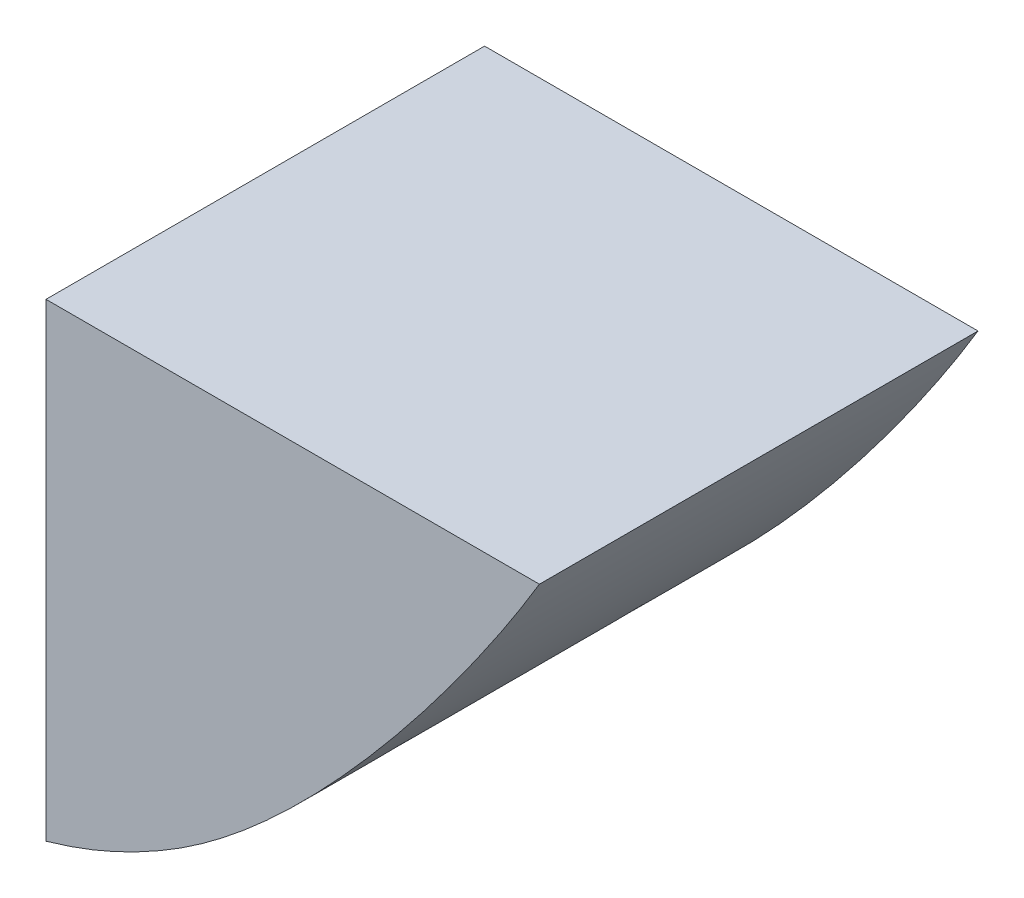
ISO-10303-21;
HEADER;
FILE_DESCRIPTION(('STEP AP214'),'2;1');
FILE_NAME('part.step','',(''),(''),'','','');
FILE_SCHEMA(('AUTOMOTIVE_DESIGN { 1 0 10303 214 1 1 1 1 }'));
ENDSEC;
DATA;
#1=APPLICATION_CONTEXT('core data for automotive mechanical design processes');
#2=APPLICATION_PROTOCOL_DEFINITION('international standard','automotive_design',2000,#1);
#3=PRODUCT_CONTEXT('',#1,'mechanical');
#4=PRODUCT('Part','Part','',(#3));
#5=PRODUCT_RELATED_PRODUCT_CATEGORY('part','',(#4));
#6=PRODUCT_DEFINITION_FORMATION('','',#4);
#7=PRODUCT_DEFINITION_CONTEXT('part definition',#1,'design');
#8=PRODUCT_DEFINITION('design','',#6,#7);
#9=PRODUCT_DEFINITION_SHAPE('','',#8);
#10=(LENGTH_UNIT() NAMED_UNIT(*) SI_UNIT(.MILLI.,.METRE.));
#11=(NAMED_UNIT(*) PLANE_ANGLE_UNIT() SI_UNIT($,.RADIAN.));
#12=(NAMED_UNIT(*) SI_UNIT($,.STERADIAN.) SOLID_ANGLE_UNIT());
#13=UNCERTAINTY_MEASURE_WITH_UNIT(LENGTH_MEASURE(1.E-05),#10,'distance_accuracy_value','');
#14=(GEOMETRIC_REPRESENTATION_CONTEXT(3) GLOBAL_UNCERTAINTY_ASSIGNED_CONTEXT((#13)) GLOBAL_UNIT_ASSIGNED_CONTEXT((#10,
#11,#12)) REPRESENTATION_CONTEXT('',''));
#15=CARTESIAN_POINT('',(0.,0.,0.));
#16=DIRECTION('',(0.,0.,1.));
#17=DIRECTION('',(1.,0.,0.));
#18=AXIS2_PLACEMENT_3D('',#15,#16,#17);
#19=CARTESIAN_POINT('',(0.,0.,8.));
#20=CARTESIAN_POINT('',(2.,0.,8.));
#21=CARTESIAN_POINT('',(5.,1.,8.));
#22=CARTESIAN_POINT('',(9.,4.,8.));
#23=CARTESIAN_POINT('',(12.,9.,8.));
#24=(BOUNDED_CURVE() B_SPLINE_CURVE(3,(#19,#20,#21,#22,#23),.UNSPECIFIED.,.F.,
.F.) B_SPLINE_CURVE_WITH_KNOTS((4,1,4),(0.,0.4,1.),
.UNSPECIFIED.) CURVE() GEOMETRIC_REPRESENTATION_ITEM() RATIONAL_B_SPLINE_CURVE((1.,0.8,1.3,0.9,1.1)) REPRESENTATION_ITEM(''));
#25=DIRECTION('',(0.,0.,-1.));
#26=VECTOR('',#25,1.);
#27=SURFACE_OF_LINEAR_EXTRUSION('',#24,#26);
#28=DIRECTION('',(0.,0.,-1.));
#29=VECTOR('',#28,1.);
#30=CARTESIAN_POINT('',(3.,0.439737105114699,8.));
#31=LINE('',#30,#29);
#32=CARTESIAN_POINT('',(3.,0.439737105114698,0.));
#33=VERTEX_POINT('',#32);
#34=CARTESIAN_POINT('',(3.,0.439737105114698,8.));
#35=VERTEX_POINT('',#34);
#36=EDGE_CURVE('E76',#33,#35,#31,.F.);
#37=ORIENTED_EDGE('',*,*,#36,.F.);
#38=CARTESIAN_POINT('',(0.,0.,0.));
#39=CARTESIAN_POINT('',(2.,0.,0.));
#40=CARTESIAN_POINT('',(5.,1.,0.));
#41=CARTESIAN_POINT('',(9.,4.,0.));
#42=CARTESIAN_POINT('',(12.,9.,0.));
#43=(BOUNDED_CURVE() B_SPLINE_CURVE(3,(#38,#39,#40,#41,#42),.UNSPECIFIED.,.F.,
.F.) B_SPLINE_CURVE_WITH_KNOTS((4,1,4),(0.,0.4,1.),
.UNSPECIFIED.) CURVE() GEOMETRIC_REPRESENTATION_ITEM() RATIONAL_B_SPLINE_CURVE((1.,0.8,1.3,0.9,1.1)) REPRESENTATION_ITEM(''));
#44=CARTESIAN_POINT('',(12.,9.,0.));
#45=VERTEX_POINT('',#44);
#46=EDGE_CURVE('E83',#33,#45,#43,.T.);
#47=ORIENTED_EDGE('',*,*,#46,.T.);
#48=DIRECTION('',(0.,0.,-1.));
#49=VECTOR('',#48,1.);
#50=CARTESIAN_POINT('',(12.,9.,8.));
#51=LINE('',#50,#49);
#52=CARTESIAN_POINT('',(12.,9.,8.));
#53=VERTEX_POINT('',#52);
#54=EDGE_CURVE('E49',#53,#45,#51,.T.);
#55=ORIENTED_EDGE('',*,*,#54,.F.);
#56=EDGE_CURVE('E64',#35,#53,#24,.T.);
#57=ORIENTED_EDGE('',*,*,#56,.F.);
#58=EDGE_LOOP('',(#37,#47,#55,#57));
#59=FACE_BOUND('',#58,.T.);
#60=ADVANCED_FACE('F41',(#59),#27,.F.);
#61=CARTESIAN_POINT('',(12.,9.,8.));
#62=DIRECTION('',(0.,-1.,0.));
#63=DIRECTION('',(0.,0.,-1.));
#64=AXIS2_PLACEMENT_3D('',#61,#62,#63);
#65=PLANE('',#64);
#66=DIRECTION('',(0.,0.,-1.));
#67=VECTOR('',#66,1.);
#68=CARTESIAN_POINT('',(3.,9.,8.));
#69=LINE('',#68,#67);
#70=CARTESIAN_POINT('',(3.,9.,8.));
#71=VERTEX_POINT('',#70);
#72=CARTESIAN_POINT('',(3.,9.,0.));
#73=VERTEX_POINT('',#72);
#74=EDGE_CURVE('E56',#71,#73,#69,.T.);
#75=ORIENTED_EDGE('',*,*,#74,.F.);
#76=DIRECTION('',(-1.,0.,0.));
#77=VECTOR('',#76,1.);
#78=CARTESIAN_POINT('',(12.,9.,8.));
#79=LINE('',#78,#77);
#80=EDGE_CURVE('E93',#53,#71,#79,.T.);
#81=ORIENTED_EDGE('',*,*,#80,.F.);
#82=ORIENTED_EDGE('',*,*,#54,.T.);
#83=DIRECTION('',(-1.,0.,0.));
#84=VECTOR('',#83,1.);
#85=CARTESIAN_POINT('',(12.,9.,0.));
#86=LINE('',#85,#84);
#87=EDGE_CURVE('E86',#45,#73,#86,.T.);
#88=ORIENTED_EDGE('',*,*,#87,.T.);
#89=EDGE_LOOP('',(#75,#81,#82,#88));
#90=FACE_BOUND('',#89,.T.);
#91=ADVANCED_FACE('F107',(#90),#65,.F.);
#92=CARTESIAN_POINT('',(5.5760448082723,1.63894872899612,8.));
#93=DIRECTION('',(0.,0.,-1.));
#94=DIRECTION('',(-1.,0.,0.));
#95=AXIS2_PLACEMENT_3D('',#92,#93,#94);
#96=PLANE('',#95);
#97=DIRECTION('',(0.,1.,0.));
#98=VECTOR('',#97,1.);
#99=CARTESIAN_POINT('',(3.,-2.,8.));
#100=LINE('',#99,#98);
#101=EDGE_CURVE('E106',#35,#71,#100,.T.);
#102=ORIENTED_EDGE('',*,*,#101,.F.);
#103=ORIENTED_EDGE('',*,*,#56,.T.);
#104=ORIENTED_EDGE('',*,*,#80,.T.);
#105=EDGE_LOOP('',(#102,#103,#104));
#106=FACE_BOUND('',#105,.T.);
#107=ADVANCED_FACE('F109',(#106),#96,.F.);
#108=CARTESIAN_POINT('',(5.5760448082723,1.63894872899612,0.));
#109=DIRECTION('',(0.,0.,-1.));
#110=DIRECTION('',(-1.,0.,0.));
#111=AXIS2_PLACEMENT_3D('',#108,#109,#110);
#112=PLANE('',#111);
#113=ORIENTED_EDGE('',*,*,#46,.F.);
#114=DIRECTION('',(0.,1.,0.));
#115=VECTOR('',#114,1.);
#116=CARTESIAN_POINT('',(3.,1.63894872899612,0.));
#117=LINE('',#116,#115);
#118=EDGE_CURVE('E11',#33,#73,#117,.T.);
#119=ORIENTED_EDGE('',*,*,#118,.T.);
#120=ORIENTED_EDGE('',*,*,#87,.F.);
#121=EDGE_LOOP('',(#113,#119,#120));
#122=FACE_BOUND('',#121,.T.);
#123=ADVANCED_FACE('F85',(#122),#112,.T.);
#124=CARTESIAN_POINT('',(3.,-2.,8.));
#125=DIRECTION('',(-1.,0.,0.));
#126=DIRECTION('',(0.,0.,1.));
#127=AXIS2_PLACEMENT_3D('',#124,#125,#126);
#128=PLANE('',#127);
#129=ORIENTED_EDGE('',*,*,#36,.T.);
#130=ORIENTED_EDGE('',*,*,#101,.T.);
#131=ORIENTED_EDGE('',*,*,#74,.T.);
#132=ORIENTED_EDGE('',*,*,#118,.F.);
#133=EDGE_LOOP('',(#129,#130,#131,#132));
#134=FACE_BOUND('',#133,.T.);
#135=ADVANCED_FACE('F75',(#134),#128,.T.);
#136=CLOSED_SHELL('',(#60,#91,#107,#123,#135));
#137=MANIFOLD_SOLID_BREP('B2',#136);
#138=ADVANCED_BREP_SHAPE_REPRESENTATION('',(#18,#137),#14);
#139=SHAPE_DEFINITION_REPRESENTATION(#9,#138);
ENDSEC;
END-ISO-10303-21;
